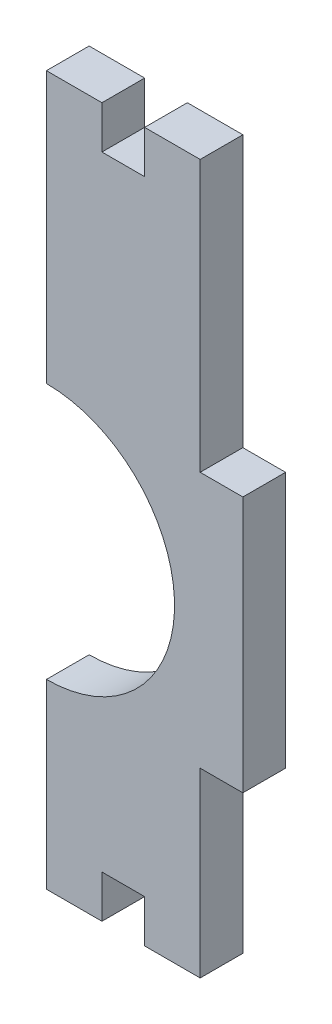
ISO-10303-21;
HEADER;
FILE_DESCRIPTION(('STEP AP214'),'2;1');
FILE_NAME('part.step','',(''),(''),'','','');
FILE_SCHEMA(('AUTOMOTIVE_DESIGN { 1 0 10303 214 1 1 1 1 }'));
ENDSEC;
DATA;
#1=APPLICATION_CONTEXT('core data for automotive mechanical design processes');
#2=APPLICATION_PROTOCOL_DEFINITION('international standard','automotive_design',2000,#1);
#3=PRODUCT_CONTEXT('',#1,'mechanical');
#4=PRODUCT('Part','Part','',(#3));
#5=PRODUCT_RELATED_PRODUCT_CATEGORY('part','',(#4));
#6=PRODUCT_DEFINITION_FORMATION('','',#4);
#7=PRODUCT_DEFINITION_CONTEXT('part definition',#1,'design');
#8=PRODUCT_DEFINITION('design','',#6,#7);
#9=PRODUCT_DEFINITION_SHAPE('','',#8);
#10=(LENGTH_UNIT() NAMED_UNIT(*) SI_UNIT(.MILLI.,.METRE.));
#11=(NAMED_UNIT(*) PLANE_ANGLE_UNIT() SI_UNIT($,.RADIAN.));
#12=(NAMED_UNIT(*) SI_UNIT($,.STERADIAN.) SOLID_ANGLE_UNIT());
#13=UNCERTAINTY_MEASURE_WITH_UNIT(LENGTH_MEASURE(1.E-05),#10,'distance_accuracy_value','');
#14=(GEOMETRIC_REPRESENTATION_CONTEXT(3) GLOBAL_UNCERTAINTY_ASSIGNED_CONTEXT((#13)) GLOBAL_UNIT_ASSIGNED_CONTEXT((#10,
#11,#12)) REPRESENTATION_CONTEXT('',''));
#15=CARTESIAN_POINT('',(0.,0.,0.));
#16=DIRECTION('',(0.,0.,1.));
#17=DIRECTION('',(1.,0.,0.));
#18=AXIS2_PLACEMENT_3D('',#15,#16,#17);
#19=CARTESIAN_POINT('',(0.,35.4361435930407,5.));
#20=DIRECTION('',(-1.,0.,0.));
#21=DIRECTION('',(0.,0.,1.));
#22=AXIS2_PLACEMENT_3D('',#19,#20,#21);
#23=PLANE('',#22);
#24=DIRECTION('',(0.,0.,1.));
#25=VECTOR('',#24,1.);
#26=CARTESIAN_POINT('',(0.,3.71114359304069,0.));
#27=LINE('',#26,#25);
#28=CARTESIAN_POINT('',(0.,3.71114359304069,0.));
#29=VERTEX_POINT('',#28);
#30=CARTESIAN_POINT('',(0.,3.71114359304069,5.));
#31=VERTEX_POINT('',#30);
#32=EDGE_CURVE('E303',#29,#31,#27,.T.);
#33=ORIENTED_EDGE('',*,*,#32,.F.);
#34=DIRECTION('',(0.,1.,0.));
#35=VECTOR('',#34,1.);
#36=CARTESIAN_POINT('',(0.,35.4361435930407,0.));
#37=LINE('',#36,#35);
#38=CARTESIAN_POINT('',(0.,35.4361435930407,0.));
#39=VERTEX_POINT('',#38);
#40=EDGE_CURVE('E184',#29,#39,#37,.T.);
#41=ORIENTED_EDGE('',*,*,#40,.T.);
#42=DIRECTION('',(0.,0.,-1.));
#43=VECTOR('',#42,1.);
#44=CARTESIAN_POINT('',(0.,35.4361435930407,5.));
#45=LINE('',#44,#43);
#46=CARTESIAN_POINT('',(0.,35.4361435930407,5.));
#47=VERTEX_POINT('',#46);
#48=EDGE_CURVE('E203',#47,#39,#45,.T.);
#49=ORIENTED_EDGE('',*,*,#48,.F.);
#50=DIRECTION('',(0.,1.,0.));
#51=VECTOR('',#50,1.);
#52=CARTESIAN_POINT('',(0.,35.4361435930407,5.));
#53=LINE('',#52,#51);
#54=EDGE_CURVE('E241',#31,#47,#53,.T.);
#55=ORIENTED_EDGE('',*,*,#54,.F.);
#56=EDGE_LOOP('',(#33,#41,#49,#55));
#57=FACE_BOUND('',#56,.T.);
#58=ADVANCED_FACE('F32',(#57),#23,.F.);
#59=CARTESIAN_POINT('',(0.,-47.5638564069593,5.));
#60=DIRECTION('',(0.,1.,0.));
#61=DIRECTION('',(0.,0.,1.));
#62=AXIS2_PLACEMENT_3D('',#59,#60,#61);
#63=PLANE('',#62);
#64=DIRECTION('',(1.,0.,0.));
#65=VECTOR('',#64,1.);
#66=CARTESIAN_POINT('',(0.,-47.5638564069593,0.));
#67=LINE('',#66,#65);
#68=CARTESIAN_POINT('',(-18.,-47.5638564069593,0.));
#69=VERTEX_POINT('',#68);
#70=CARTESIAN_POINT('',(-11.5000000000002,-47.5638564069593,0.));
#71=VERTEX_POINT('',#70);
#72=EDGE_CURVE('E188',#69,#71,#67,.T.);
#73=ORIENTED_EDGE('',*,*,#72,.T.);
#74=DIRECTION('',(0.,0.,1.));
#75=VECTOR('',#74,1.);
#76=CARTESIAN_POINT('',(-11.5000000000002,-47.5638564069593,0.));
#77=LINE('',#76,#75);
#78=CARTESIAN_POINT('',(-11.5000000000002,-47.5638564069593,5.));
#79=VERTEX_POINT('',#78);
#80=EDGE_CURVE('E277',#71,#79,#77,.T.);
#81=ORIENTED_EDGE('',*,*,#80,.T.);
#82=DIRECTION('',(1.,0.,0.));
#83=VECTOR('',#82,1.);
#84=CARTESIAN_POINT('',(0.,-47.5638564069593,5.));
#85=LINE('',#84,#83);
#86=CARTESIAN_POINT('',(-18.,-47.5638564069593,5.));
#87=VERTEX_POINT('',#86);
#88=EDGE_CURVE('E237',#87,#79,#85,.T.);
#89=ORIENTED_EDGE('',*,*,#88,.F.);
#90=DIRECTION('',(0.,0.,-1.));
#91=VECTOR('',#90,1.);
#92=CARTESIAN_POINT('',(-18.,-47.5638564069593,5.));
#93=LINE('',#92,#91);
#94=EDGE_CURVE('E208',#87,#69,#93,.T.);
#95=ORIENTED_EDGE('',*,*,#94,.T.);
#96=EDGE_LOOP('',(#73,#81,#89,#95));
#97=FACE_BOUND('',#96,.T.);
#98=ADVANCED_FACE('F345',(#97),#63,.F.);
#99=CARTESIAN_POINT('',(-18.0000000000002,35.4361435930407,5.));
#100=DIRECTION('',(0.,-1.,0.));
#101=DIRECTION('',(0.,0.,-1.));
#102=AXIS2_PLACEMENT_3D('',#99,#100,#101);
#103=PLANE('',#102);
#104=DIRECTION('',(-1.,0.,0.));
#105=VECTOR('',#104,1.);
#106=CARTESIAN_POINT('',(-18.0000000000002,35.4361435930407,5.));
#107=LINE('',#106,#105);
#108=CARTESIAN_POINT('',(-11.5000000000002,35.4361435930407,5.));
#109=VERTEX_POINT('',#108);
#110=CARTESIAN_POINT('',(-18.0000000000002,35.4361435930407,5.));
#111=VERTEX_POINT('',#110);
#112=EDGE_CURVE('E234',#109,#111,#107,.T.);
#113=ORIENTED_EDGE('',*,*,#112,.F.);
#114=DIRECTION('',(0.,0.,1.));
#115=VECTOR('',#114,1.);
#116=CARTESIAN_POINT('',(-11.5000000000002,35.4361435930407,0.));
#117=LINE('',#116,#115);
#118=CARTESIAN_POINT('',(-11.5000000000002,35.4361435930407,0.));
#119=VERTEX_POINT('',#118);
#120=EDGE_CURVE('E231',#119,#109,#117,.T.);
#121=ORIENTED_EDGE('',*,*,#120,.F.);
#122=DIRECTION('',(-1.,0.,0.));
#123=VECTOR('',#122,1.);
#124=CARTESIAN_POINT('',(-18.0000000000002,35.4361435930407,0.));
#125=LINE('',#124,#123);
#126=CARTESIAN_POINT('',(-18.0000000000002,35.4361435930407,0.));
#127=VERTEX_POINT('',#126);
#128=EDGE_CURVE('E183',#119,#127,#125,.T.);
#129=ORIENTED_EDGE('',*,*,#128,.T.);
#130=DIRECTION('',(0.,0.,-1.));
#131=VECTOR('',#130,1.);
#132=CARTESIAN_POINT('',(-18.0000000000002,35.4361435930407,5.));
#133=LINE('',#132,#131);
#134=EDGE_CURVE('E200',#111,#127,#133,.T.);
#135=ORIENTED_EDGE('',*,*,#134,.F.);
#136=EDGE_LOOP('',(#113,#121,#129,#135));
#137=FACE_BOUND('',#136,.T.);
#138=ADVANCED_FACE('F342',(#137),#103,.F.);
#139=CARTESIAN_POINT('',(-18.0000000000002,35.4361435930407,5.));
#140=DIRECTION('',(1.,0.,0.));
#141=DIRECTION('',(0.,1.,0.));
#142=AXIS2_PLACEMENT_3D('',#139,#140,#141);
#143=PLANE('',#142);
#144=DIRECTION('',(0.,-1.,0.));
#145=VECTOR('',#144,1.);
#146=CARTESIAN_POINT('',(-18.0000000000002,35.4361435930407,0.));
#147=LINE('',#146,#145);
#148=CARTESIAN_POINT('',(-18.0000000000002,3.71114359304063,0.));
#149=VERTEX_POINT('',#148);
#150=EDGE_CURVE('E226',#127,#149,#147,.T.);
#151=ORIENTED_EDGE('',*,*,#150,.T.);
#152=DIRECTION('',(0.,0.,-1.));
#153=VECTOR('',#152,1.);
#154=CARTESIAN_POINT('',(-18.0000000000002,3.71114359304063,5.));
#155=LINE('',#154,#153);
#156=CARTESIAN_POINT('',(-18.0000000000002,3.71114359304063,5.));
#157=VERTEX_POINT('',#156);
#158=EDGE_CURVE('E11',#157,#149,#155,.T.);
#159=ORIENTED_EDGE('',*,*,#158,.F.);
#160=DIRECTION('',(0.,-1.,0.));
#161=VECTOR('',#160,1.);
#162=CARTESIAN_POINT('',(-18.0000000000002,35.4361435930407,5.));
#163=LINE('',#162,#161);
#164=EDGE_CURVE('E199',#111,#157,#163,.T.);
#165=ORIENTED_EDGE('',*,*,#164,.F.);
#166=ORIENTED_EDGE('',*,*,#134,.T.);
#167=EDGE_LOOP('',(#151,#159,#165,#166));
#168=FACE_BOUND('',#167,.T.);
#169=ADVANCED_FACE('F34',(#168),#143,.F.);
#170=CARTESIAN_POINT('',(-18.,-11.2888564069594,5.));
#171=DIRECTION('',(0.,0.,-1.));
#172=DIRECTION('',(-1.,0.,0.));
#173=AXIS2_PLACEMENT_3D('',#170,#171,#172);
#174=CYLINDRICAL_SURFACE('',#173,15.);
#175=CARTESIAN_POINT('',(-18.,-11.2888564069594,0.));
#176=DIRECTION('',(0.,0.,-1.));
#177=DIRECTION('',(1.,0.,0.));
#178=AXIS2_PLACEMENT_3D('',#175,#176,#177);
#179=CIRCLE('',#178,15.);
#180=CARTESIAN_POINT('',(-17.9999999999998,-26.2888564069593,0.));
#181=VERTEX_POINT('',#180);
#182=EDGE_CURVE('E222',#149,#181,#179,.T.);
#183=ORIENTED_EDGE('',*,*,#182,.T.);
#184=DIRECTION('',(0.,0.,-1.));
#185=VECTOR('',#184,1.);
#186=CARTESIAN_POINT('',(-17.9999999999998,-26.2888564069593,5.));
#187=LINE('',#186,#185);
#188=CARTESIAN_POINT('',(-17.9999999999998,-26.2888564069593,5.));
#189=VERTEX_POINT('',#188);
#190=EDGE_CURVE('E41',#189,#181,#187,.T.);
#191=ORIENTED_EDGE('',*,*,#190,.F.);
#192=CARTESIAN_POINT('',(-18.,-11.2888564069594,5.));
#193=DIRECTION('',(0.,0.,-1.));
#194=DIRECTION('',(1.,0.,0.));
#195=AXIS2_PLACEMENT_3D('',#192,#193,#194);
#196=CIRCLE('',#195,15.);
#197=EDGE_CURVE('E254',#157,#189,#196,.T.);
#198=ORIENTED_EDGE('',*,*,#197,.F.);
#199=ORIENTED_EDGE('',*,*,#158,.T.);
#200=EDGE_LOOP('',(#183,#191,#198,#199));
#201=FACE_BOUND('',#200,.T.);
#202=ADVANCED_FACE('F363',(#201),#174,.F.);
#203=CARTESIAN_POINT('',(-18.,-47.5638564069593,5.));
#204=DIRECTION('',(1.,0.,0.));
#205=DIRECTION('',(0.,1.,0.));
#206=AXIS2_PLACEMENT_3D('',#203,#204,#205);
#207=PLANE('',#206);
#208=DIRECTION('',(0.,-1.,0.));
#209=VECTOR('',#208,1.);
#210=CARTESIAN_POINT('',(-18.,-47.5638564069593,0.));
#211=LINE('',#210,#209);
#212=EDGE_CURVE('E217',#181,#69,#211,.T.);
#213=ORIENTED_EDGE('',*,*,#212,.T.);
#214=ORIENTED_EDGE('',*,*,#94,.F.);
#215=DIRECTION('',(0.,-1.,0.));
#216=VECTOR('',#215,1.);
#217=CARTESIAN_POINT('',(-18.,-47.5638564069593,5.));
#218=LINE('',#217,#216);
#219=EDGE_CURVE('E218',#189,#87,#218,.T.);
#220=ORIENTED_EDGE('',*,*,#219,.F.);
#221=ORIENTED_EDGE('',*,*,#190,.T.);
#222=EDGE_LOOP('',(#213,#214,#220,#221));
#223=FACE_BOUND('',#222,.T.);
#224=ADVANCED_FACE('F215',(#223),#207,.F.);
#225=CARTESIAN_POINT('',(-6.50000000000017,-47.5638564069593,5.));
#226=VERTEX_POINT('',#225);
#227=CARTESIAN_POINT('',(0.,-47.5638564069593,5.));
#228=VERTEX_POINT('',#227);
#229=EDGE_CURVE('E249',#226,#228,#85,.T.);
#230=ORIENTED_EDGE('',*,*,#229,.F.);
#231=DIRECTION('',(0.,0.,1.));
#232=VECTOR('',#231,1.);
#233=CARTESIAN_POINT('',(-6.50000000000017,-47.5638564069593,0.));
#234=LINE('',#233,#232);
#235=CARTESIAN_POINT('',(-6.50000000000017,-47.5638564069593,0.));
#236=VERTEX_POINT('',#235);
#237=EDGE_CURVE('E285',#236,#226,#234,.T.);
#238=ORIENTED_EDGE('',*,*,#237,.F.);
#239=CARTESIAN_POINT('',(0.,-47.5638564069593,0.));
#240=VERTEX_POINT('',#239);
#241=EDGE_CURVE('E225',#236,#240,#67,.T.);
#242=ORIENTED_EDGE('',*,*,#241,.T.);
#243=DIRECTION('',(0.,0.,-1.));
#244=VECTOR('',#243,1.);
#245=CARTESIAN_POINT('',(0.,-47.5638564069593,5.));
#246=LINE('',#245,#244);
#247=EDGE_CURVE('E182',#228,#240,#246,.T.);
#248=ORIENTED_EDGE('',*,*,#247,.F.);
#249=EDGE_LOOP('',(#230,#238,#242,#248));
#250=FACE_BOUND('',#249,.T.);
#251=ADVANCED_FACE('F353',(#250),#63,.F.);
#252=CARTESIAN_POINT('',(0.,-26.2888564069593,0.));
#253=VERTEX_POINT('',#252);
#254=EDGE_CURVE('E173',#240,#253,#37,.T.);
#255=ORIENTED_EDGE('',*,*,#254,.T.);
#256=DIRECTION('',(0.,0.,1.));
#257=VECTOR('',#256,1.);
#258=CARTESIAN_POINT('',(0.,-26.2888564069593,0.));
#259=LINE('',#258,#257);
#260=CARTESIAN_POINT('',(0.,-26.2888564069593,5.));
#261=VERTEX_POINT('',#260);
#262=EDGE_CURVE('E157',#253,#261,#259,.T.);
#263=ORIENTED_EDGE('',*,*,#262,.T.);
#264=EDGE_CURVE('E243',#228,#261,#53,.T.);
#265=ORIENTED_EDGE('',*,*,#264,.F.);
#266=ORIENTED_EDGE('',*,*,#247,.T.);
#267=EDGE_LOOP('',(#255,#263,#265,#266));
#268=FACE_BOUND('',#267,.T.);
#269=ADVANCED_FACE('F180',(#268),#23,.F.);
#270=CARTESIAN_POINT('',(-6.50000000000017,35.4361435930407,0.));
#271=VERTEX_POINT('',#270);
#272=EDGE_CURVE('E186',#39,#271,#125,.T.);
#273=ORIENTED_EDGE('',*,*,#272,.T.);
#274=DIRECTION('',(0.,0.,1.));
#275=VECTOR('',#274,1.);
#276=CARTESIAN_POINT('',(-6.50000000000017,35.4361435930407,0.));
#277=LINE('',#276,#275);
#278=CARTESIAN_POINT('',(-6.50000000000017,35.4361435930407,5.));
#279=VERTEX_POINT('',#278);
#280=EDGE_CURVE('E264',#271,#279,#277,.T.);
#281=ORIENTED_EDGE('',*,*,#280,.T.);
#282=EDGE_CURVE('E204',#47,#279,#107,.T.);
#283=ORIENTED_EDGE('',*,*,#282,.F.);
#284=ORIENTED_EDGE('',*,*,#48,.T.);
#285=EDGE_LOOP('',(#273,#281,#283,#284));
#286=FACE_BOUND('',#285,.T.);
#287=ADVANCED_FACE('F332',(#286),#103,.F.);
#288=CARTESIAN_POINT('',(-18.,-11.2888564069594,5.));
#289=DIRECTION('',(0.,0.,1.));
#290=DIRECTION('',(1.,0.,0.));
#291=AXIS2_PLACEMENT_3D('',#288,#289,#290);
#292=PLANE('',#291);
#293=DIRECTION('',(0.,-1.,0.));
#294=VECTOR('',#293,1.);
#295=CARTESIAN_POINT('',(-11.5000000000002,-47.5638564069593,5.));
#296=LINE('',#295,#294);
#297=CARTESIAN_POINT('',(-11.5000000000002,-42.5638564069593,5.));
#298=VERTEX_POINT('',#297);
#299=EDGE_CURVE('E294',#298,#79,#296,.T.);
#300=ORIENTED_EDGE('',*,*,#299,.F.);
#301=DIRECTION('',(-1.,0.,0.));
#302=VECTOR('',#301,1.);
#303=CARTESIAN_POINT('',(-11.5000000000002,-42.5638564069593,5.));
#304=LINE('',#303,#302);
#305=CARTESIAN_POINT('',(-6.50000000000017,-42.5638564069593,5.));
#306=VERTEX_POINT('',#305);
#307=EDGE_CURVE('E297',#306,#298,#304,.T.);
#308=ORIENTED_EDGE('',*,*,#307,.F.);
#309=DIRECTION('',(0.,1.,0.));
#310=VECTOR('',#309,1.);
#311=CARTESIAN_POINT('',(-6.50000000000017,-47.5638564069593,5.));
#312=LINE('',#311,#310);
#313=EDGE_CURVE('E300',#226,#306,#312,.T.);
#314=ORIENTED_EDGE('',*,*,#313,.F.);
#315=ORIENTED_EDGE('',*,*,#229,.T.);
#316=ORIENTED_EDGE('',*,*,#264,.T.);
#317=DIRECTION('',(1.,0.,0.));
#318=VECTOR('',#317,1.);
#319=CARTESIAN_POINT('',(0.,-26.2888564069593,5.));
#320=LINE('',#319,#318);
#321=CARTESIAN_POINT('',(5.,-26.2888564069593,5.));
#322=VERTEX_POINT('',#321);
#323=EDGE_CURVE('E49',#261,#322,#320,.T.);
#324=ORIENTED_EDGE('',*,*,#323,.T.);
#325=DIRECTION('',(0.,1.,0.));
#326=VECTOR('',#325,1.);
#327=CARTESIAN_POINT('',(5.,3.71114359304069,5.));
#328=LINE('',#327,#326);
#329=CARTESIAN_POINT('',(5.,3.71114359304069,5.));
#330=VERTEX_POINT('',#329);
#331=EDGE_CURVE('E322',#322,#330,#328,.T.);
#332=ORIENTED_EDGE('',*,*,#331,.T.);
#333=DIRECTION('',(-1.,0.,0.));
#334=VECTOR('',#333,1.);
#335=CARTESIAN_POINT('',(0.,3.71114359304069,5.));
#336=LINE('',#335,#334);
#337=EDGE_CURVE('E177',#330,#31,#336,.T.);
#338=ORIENTED_EDGE('',*,*,#337,.T.);
#339=ORIENTED_EDGE('',*,*,#54,.T.);
#340=ORIENTED_EDGE('',*,*,#282,.T.);
#341=DIRECTION('',(0.,1.,0.));
#342=VECTOR('',#341,1.);
#343=CARTESIAN_POINT('',(-6.50000000000017,35.4361435930407,5.));
#344=LINE('',#343,#342);
#345=CARTESIAN_POINT('',(-6.50000000000017,30.4361435930407,5.));
#346=VERTEX_POINT('',#345);
#347=EDGE_CURVE('E268',#346,#279,#344,.T.);
#348=ORIENTED_EDGE('',*,*,#347,.F.);
#349=DIRECTION('',(1.,0.,0.));
#350=VECTOR('',#349,1.);
#351=CARTESIAN_POINT('',(-11.5000000000002,30.4361435930407,5.));
#352=LINE('',#351,#350);
#353=CARTESIAN_POINT('',(-11.5000000000002,30.4361435930407,5.));
#354=VERTEX_POINT('',#353);
#355=EDGE_CURVE('E271',#354,#346,#352,.T.);
#356=ORIENTED_EDGE('',*,*,#355,.F.);
#357=DIRECTION('',(0.,-1.,0.));
#358=VECTOR('',#357,1.);
#359=CARTESIAN_POINT('',(-11.5000000000002,35.4361435930407,5.));
#360=LINE('',#359,#358);
#361=EDGE_CURVE('E274',#109,#354,#360,.T.);
#362=ORIENTED_EDGE('',*,*,#361,.F.);
#363=ORIENTED_EDGE('',*,*,#112,.T.);
#364=ORIENTED_EDGE('',*,*,#164,.T.);
#365=ORIENTED_EDGE('',*,*,#197,.T.);
#366=ORIENTED_EDGE('',*,*,#219,.T.);
#367=ORIENTED_EDGE('',*,*,#88,.T.);
#368=EDGE_LOOP('',(#300,#308,#314,#315,#316,#324,#332,#338,#339,#340,#348,#356,#362,#363,#364,
#365,#366,#367));
#369=FACE_BOUND('',#368,.T.);
#370=ADVANCED_FACE('F329',(#369),#292,.T.);
#371=CARTESIAN_POINT('',(-18.,-11.2888564069594,0.));
#372=DIRECTION('',(0.,0.,1.));
#373=DIRECTION('',(1.,0.,0.));
#374=AXIS2_PLACEMENT_3D('',#371,#372,#373);
#375=PLANE('',#374);
#376=DIRECTION('',(-1.,0.,0.));
#377=VECTOR('',#376,1.);
#378=CARTESIAN_POINT('',(-11.5000000000002,-42.5638564069593,0.));
#379=LINE('',#378,#377);
#380=CARTESIAN_POINT('',(-6.50000000000017,-42.5638564069593,0.));
#381=VERTEX_POINT('',#380);
#382=CARTESIAN_POINT('',(-11.5000000000002,-42.5638564069593,0.));
#383=VERTEX_POINT('',#382);
#384=EDGE_CURVE('E57',#381,#383,#379,.T.);
#385=ORIENTED_EDGE('',*,*,#384,.T.);
#386=DIRECTION('',(0.,-1.,0.));
#387=VECTOR('',#386,1.);
#388=CARTESIAN_POINT('',(-11.5000000000002,-47.5638564069593,0.));
#389=LINE('',#388,#387);
#390=EDGE_CURVE('E288',#383,#71,#389,.T.);
#391=ORIENTED_EDGE('',*,*,#390,.T.);
#392=ORIENTED_EDGE('',*,*,#72,.F.);
#393=ORIENTED_EDGE('',*,*,#212,.F.);
#394=ORIENTED_EDGE('',*,*,#182,.F.);
#395=ORIENTED_EDGE('',*,*,#150,.F.);
#396=ORIENTED_EDGE('',*,*,#128,.F.);
#397=DIRECTION('',(0.,-1.,0.));
#398=VECTOR('',#397,1.);
#399=CARTESIAN_POINT('',(-11.5000000000002,35.4361435930407,0.));
#400=LINE('',#399,#398);
#401=CARTESIAN_POINT('',(-11.5000000000002,30.4361435930407,0.));
#402=VERTEX_POINT('',#401);
#403=EDGE_CURVE('E270',#119,#402,#400,.T.);
#404=ORIENTED_EDGE('',*,*,#403,.T.);
#405=DIRECTION('',(1.,0.,0.));
#406=VECTOR('',#405,1.);
#407=CARTESIAN_POINT('',(-11.5000000000002,30.4361435930407,0.));
#408=LINE('',#407,#406);
#409=CARTESIAN_POINT('',(-6.50000000000017,30.4361435930407,0.));
#410=VERTEX_POINT('',#409);
#411=EDGE_CURVE('E280',#402,#410,#408,.T.);
#412=ORIENTED_EDGE('',*,*,#411,.T.);
#413=DIRECTION('',(0.,1.,0.));
#414=VECTOR('',#413,1.);
#415=CARTESIAN_POINT('',(-6.50000000000017,35.4361435930407,0.));
#416=LINE('',#415,#414);
#417=EDGE_CURVE('E262',#410,#271,#416,.T.);
#418=ORIENTED_EDGE('',*,*,#417,.T.);
#419=ORIENTED_EDGE('',*,*,#272,.F.);
#420=ORIENTED_EDGE('',*,*,#40,.F.);
#421=DIRECTION('',(-1.,0.,0.));
#422=VECTOR('',#421,1.);
#423=CARTESIAN_POINT('',(0.,3.71114359304069,0.));
#424=LINE('',#423,#422);
#425=CARTESIAN_POINT('',(5.,3.71114359304069,0.));
#426=VERTEX_POINT('',#425);
#427=EDGE_CURVE('E166',#426,#29,#424,.T.);
#428=ORIENTED_EDGE('',*,*,#427,.F.);
#429=DIRECTION('',(0.,1.,0.));
#430=VECTOR('',#429,1.);
#431=CARTESIAN_POINT('',(5.,3.71114359304069,0.));
#432=LINE('',#431,#430);
#433=CARTESIAN_POINT('',(5.,-26.2888564069593,0.));
#434=VERTEX_POINT('',#433);
#435=EDGE_CURVE('E176',#434,#426,#432,.T.);
#436=ORIENTED_EDGE('',*,*,#435,.F.);
#437=DIRECTION('',(1.,0.,0.));
#438=VECTOR('',#437,1.);
#439=CARTESIAN_POINT('',(0.,-26.2888564069593,0.));
#440=LINE('',#439,#438);
#441=EDGE_CURVE('E160',#253,#434,#440,.T.);
#442=ORIENTED_EDGE('',*,*,#441,.F.);
#443=ORIENTED_EDGE('',*,*,#254,.F.);
#444=ORIENTED_EDGE('',*,*,#241,.F.);
#445=DIRECTION('',(0.,1.,0.));
#446=VECTOR('',#445,1.);
#447=CARTESIAN_POINT('',(-6.50000000000017,-47.5638564069593,0.));
#448=LINE('',#447,#446);
#449=EDGE_CURVE('E296',#236,#381,#448,.T.);
#450=ORIENTED_EDGE('',*,*,#449,.T.);
#451=EDGE_LOOP('',(#385,#391,#392,#393,#394,#395,#396,#404,#412,#418,#419,#420,#428,#436,#442,
#443,#444,#450));
#452=FACE_BOUND('',#451,.T.);
#453=ADVANCED_FACE('F171',(#452),#375,.F.);
#454=CARTESIAN_POINT('',(-11.5000000000002,35.4361435930407,0.));
#455=DIRECTION('',(-1.,0.,0.));
#456=DIRECTION('',(0.,-1.,0.));
#457=AXIS2_PLACEMENT_3D('',#454,#455,#456);
#458=PLANE('',#457);
#459=ORIENTED_EDGE('',*,*,#361,.T.);
#460=DIRECTION('',(0.,0.,1.));
#461=VECTOR('',#460,1.);
#462=CARTESIAN_POINT('',(-11.5000000000002,30.4361435930407,0.));
#463=LINE('',#462,#461);
#464=EDGE_CURVE('E259',#402,#354,#463,.T.);
#465=ORIENTED_EDGE('',*,*,#464,.F.);
#466=ORIENTED_EDGE('',*,*,#403,.F.);
#467=ORIENTED_EDGE('',*,*,#120,.T.);
#468=EDGE_LOOP('',(#459,#465,#466,#467));
#469=FACE_BOUND('',#468,.T.);
#470=ADVANCED_FACE('F338',(#469),#458,.F.);
#471=CARTESIAN_POINT('',(-6.50000000000017,35.4361435930407,0.));
#472=DIRECTION('',(1.,0.,0.));
#473=DIRECTION('',(0.,0.,-1.));
#474=AXIS2_PLACEMENT_3D('',#471,#472,#473);
#475=PLANE('',#474);
#476=ORIENTED_EDGE('',*,*,#347,.T.);
#477=ORIENTED_EDGE('',*,*,#280,.F.);
#478=ORIENTED_EDGE('',*,*,#417,.F.);
#479=DIRECTION('',(0.,0.,1.));
#480=VECTOR('',#479,1.);
#481=CARTESIAN_POINT('',(-6.50000000000017,30.4361435930407,0.));
#482=LINE('',#481,#480);
#483=EDGE_CURVE('E261',#410,#346,#482,.T.);
#484=ORIENTED_EDGE('',*,*,#483,.T.);
#485=EDGE_LOOP('',(#476,#477,#478,#484));
#486=FACE_BOUND('',#485,.T.);
#487=ADVANCED_FACE('F412',(#486),#475,.F.);
#488=CARTESIAN_POINT('',(-11.5000000000002,30.4361435930407,0.));
#489=DIRECTION('',(0.,-1.,0.));
#490=DIRECTION('',(0.,0.,-1.));
#491=AXIS2_PLACEMENT_3D('',#488,#489,#490);
#492=PLANE('',#491);
#493=ORIENTED_EDGE('',*,*,#355,.T.);
#494=ORIENTED_EDGE('',*,*,#483,.F.);
#495=ORIENTED_EDGE('',*,*,#411,.F.);
#496=ORIENTED_EDGE('',*,*,#464,.T.);
#497=EDGE_LOOP('',(#493,#494,#495,#496));
#498=FACE_BOUND('',#497,.T.);
#499=ADVANCED_FACE('F383',(#498),#492,.F.);
#500=CARTESIAN_POINT('',(-11.5000000000002,-47.5638564069593,0.));
#501=DIRECTION('',(-1.,0.,0.));
#502=DIRECTION('',(0.,-1.,0.));
#503=AXIS2_PLACEMENT_3D('',#500,#501,#502);
#504=PLANE('',#503);
#505=ORIENTED_EDGE('',*,*,#299,.T.);
#506=ORIENTED_EDGE('',*,*,#80,.F.);
#507=ORIENTED_EDGE('',*,*,#390,.F.);
#508=DIRECTION('',(0.,0.,1.));
#509=VECTOR('',#508,1.);
#510=CARTESIAN_POINT('',(-11.5000000000002,-42.5638564069593,0.));
#511=LINE('',#510,#509);
#512=EDGE_CURVE('E290',#383,#298,#511,.T.);
#513=ORIENTED_EDGE('',*,*,#512,.T.);
#514=EDGE_LOOP('',(#505,#506,#507,#513));
#515=FACE_BOUND('',#514,.T.);
#516=ADVANCED_FACE('F406',(#515),#504,.F.);
#517=CARTESIAN_POINT('',(-11.5000000000002,-42.5638564069593,0.));
#518=DIRECTION('',(0.,1.,0.));
#519=DIRECTION('',(0.,0.,1.));
#520=AXIS2_PLACEMENT_3D('',#517,#518,#519);
#521=PLANE('',#520);
#522=ORIENTED_EDGE('',*,*,#307,.T.);
#523=ORIENTED_EDGE('',*,*,#512,.F.);
#524=ORIENTED_EDGE('',*,*,#384,.F.);
#525=DIRECTION('',(0.,0.,1.));
#526=VECTOR('',#525,1.);
#527=CARTESIAN_POINT('',(-6.50000000000017,-42.5638564069593,0.));
#528=LINE('',#527,#526);
#529=EDGE_CURVE('E287',#381,#306,#528,.T.);
#530=ORIENTED_EDGE('',*,*,#529,.T.);
#531=EDGE_LOOP('',(#522,#523,#524,#530));
#532=FACE_BOUND('',#531,.T.);
#533=ADVANCED_FACE('F400',(#532),#521,.F.);
#534=CARTESIAN_POINT('',(-6.50000000000017,-47.5638564069593,0.));
#535=DIRECTION('',(1.,0.,0.));
#536=DIRECTION('',(0.,0.,-1.));
#537=AXIS2_PLACEMENT_3D('',#534,#535,#536);
#538=PLANE('',#537);
#539=ORIENTED_EDGE('',*,*,#313,.T.);
#540=ORIENTED_EDGE('',*,*,#529,.F.);
#541=ORIENTED_EDGE('',*,*,#449,.F.);
#542=ORIENTED_EDGE('',*,*,#237,.T.);
#543=EDGE_LOOP('',(#539,#540,#541,#542));
#544=FACE_BOUND('',#543,.T.);
#545=ADVANCED_FACE('F393',(#544),#538,.F.);
#546=CARTESIAN_POINT('',(0.,3.71114359304069,0.));
#547=DIRECTION('',(0.,1.,0.));
#548=DIRECTION('',(0.,0.,1.));
#549=AXIS2_PLACEMENT_3D('',#546,#547,#548);
#550=PLANE('',#549);
#551=ORIENTED_EDGE('',*,*,#337,.F.);
#552=DIRECTION('',(0.,0.,1.));
#553=VECTOR('',#552,1.);
#554=CARTESIAN_POINT('',(5.,3.71114359304069,0.));
#555=LINE('',#554,#553);
#556=EDGE_CURVE('E318',#426,#330,#555,.T.);
#557=ORIENTED_EDGE('',*,*,#556,.F.);
#558=ORIENTED_EDGE('',*,*,#427,.T.);
#559=ORIENTED_EDGE('',*,*,#32,.T.);
#560=EDGE_LOOP('',(#551,#557,#558,#559));
#561=FACE_BOUND('',#560,.T.);
#562=ADVANCED_FACE('F390',(#561),#550,.T.);
#563=CARTESIAN_POINT('',(5.,3.71114359304069,0.));
#564=DIRECTION('',(1.,0.,0.));
#565=DIRECTION('',(0.,0.,-1.));
#566=AXIS2_PLACEMENT_3D('',#563,#564,#565);
#567=PLANE('',#566);
#568=ORIENTED_EDGE('',*,*,#331,.F.);
#569=DIRECTION('',(0.,0.,1.));
#570=VECTOR('',#569,1.);
#571=CARTESIAN_POINT('',(5.,-26.2888564069593,0.));
#572=LINE('',#571,#570);
#573=EDGE_CURVE('E165',#434,#322,#572,.T.);
#574=ORIENTED_EDGE('',*,*,#573,.F.);
#575=ORIENTED_EDGE('',*,*,#435,.T.);
#576=ORIENTED_EDGE('',*,*,#556,.T.);
#577=EDGE_LOOP('',(#568,#574,#575,#576));
#578=FACE_BOUND('',#577,.T.);
#579=ADVANCED_FACE('F327',(#578),#567,.T.);
#580=CARTESIAN_POINT('',(0.,-26.2888564069593,0.));
#581=DIRECTION('',(0.,-1.,0.));
#582=DIRECTION('',(0.,0.,-1.));
#583=AXIS2_PLACEMENT_3D('',#580,#581,#582);
#584=PLANE('',#583);
#585=ORIENTED_EDGE('',*,*,#323,.F.);
#586=ORIENTED_EDGE('',*,*,#262,.F.);
#587=ORIENTED_EDGE('',*,*,#441,.T.);
#588=ORIENTED_EDGE('',*,*,#573,.T.);
#589=EDGE_LOOP('',(#585,#586,#587,#588));
#590=FACE_BOUND('',#589,.T.);
#591=ADVANCED_FACE('F159',(#590),#584,.T.);
#592=CLOSED_SHELL('',(#58,#98,#138,#169,#202,#224,#251,#269,#287,#370,#453,#470,#487,#499,#516,
#533,#545,#562,#579,#591));
#593=MANIFOLD_SOLID_BREP('B2',#592);
#594=ADVANCED_BREP_SHAPE_REPRESENTATION('',(#18,#593),#14);
#595=SHAPE_DEFINITION_REPRESENTATION(#9,#594);
ENDSEC;
END-ISO-10303-21;
